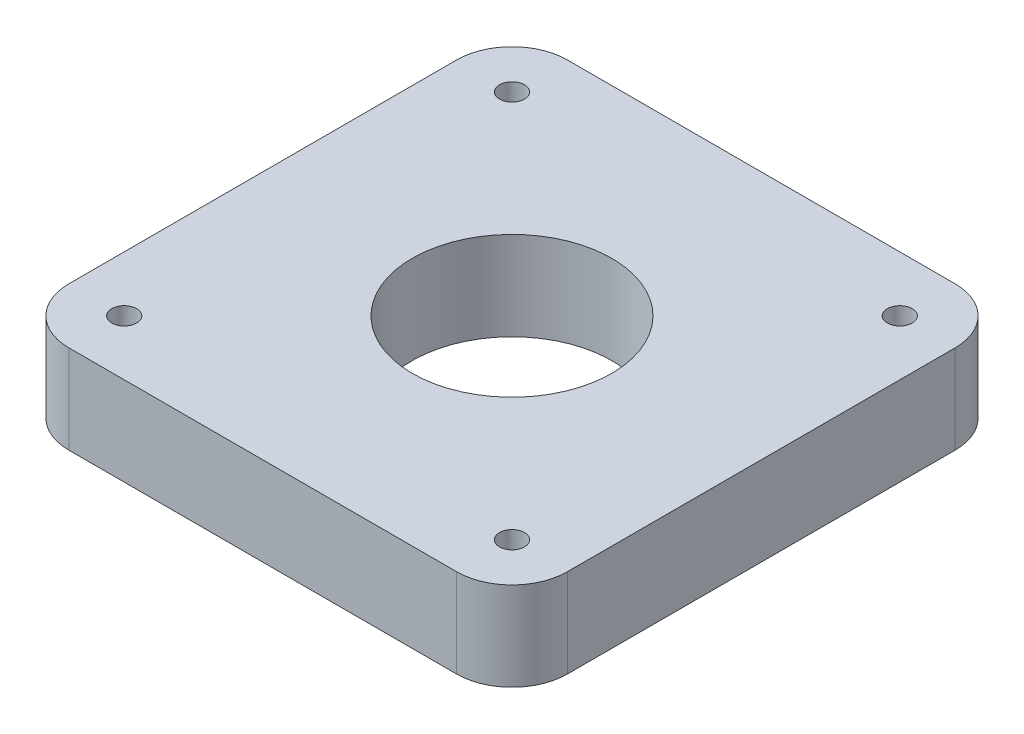
ISO-10303-21;
HEADER;
FILE_DESCRIPTION(('STEP AP214'),'2;1');
FILE_NAME('part.step','',(''),(''),'','','');
FILE_SCHEMA(('AUTOMOTIVE_DESIGN { 1 0 10303 214 1 1 1 1 }'));
ENDSEC;
DATA;
#1=APPLICATION_CONTEXT('core data for automotive mechanical design processes');
#2=APPLICATION_PROTOCOL_DEFINITION('international standard','automotive_design',2000,#1);
#3=PRODUCT_CONTEXT('',#1,'mechanical');
#4=PRODUCT('Part','Part','',(#3));
#5=PRODUCT_RELATED_PRODUCT_CATEGORY('part','',(#4));
#6=PRODUCT_DEFINITION_FORMATION('','',#4);
#7=PRODUCT_DEFINITION_CONTEXT('part definition',#1,'design');
#8=PRODUCT_DEFINITION('design','',#6,#7);
#9=PRODUCT_DEFINITION_SHAPE('','',#8);
#10=(LENGTH_UNIT() NAMED_UNIT(*) SI_UNIT(.MILLI.,.METRE.));
#11=(NAMED_UNIT(*) PLANE_ANGLE_UNIT() SI_UNIT($,.RADIAN.));
#12=(NAMED_UNIT(*) SI_UNIT($,.STERADIAN.) SOLID_ANGLE_UNIT());
#13=UNCERTAINTY_MEASURE_WITH_UNIT(LENGTH_MEASURE(1.E-05),#10,'distance_accuracy_value','');
#14=(GEOMETRIC_REPRESENTATION_CONTEXT(3) GLOBAL_UNCERTAINTY_ASSIGNED_CONTEXT((#13)) GLOBAL_UNIT_ASSIGNED_CONTEXT((#10,
#11,#12)) REPRESENTATION_CONTEXT('',''));
#15=CARTESIAN_POINT('',(0.,0.,0.));
#16=DIRECTION('',(0.,0.,1.));
#17=DIRECTION('',(1.,0.,0.));
#18=AXIS2_PLACEMENT_3D('',#15,#16,#17);
#19=CARTESIAN_POINT('',(0.,8.,22.5));
#20=DIRECTION('',(0.,0.,-1.));
#21=DIRECTION('',(-1.,0.,0.));
#22=AXIS2_PLACEMENT_3D('',#19,#20,#21);
#23=PLANE('',#22);
#24=DIRECTION('',(1.,0.,0.));
#25=VECTOR('',#24,1.);
#26=CARTESIAN_POINT('',(0.,0.,22.5));
#27=LINE('',#26,#25);
#28=CARTESIAN_POINT('',(-17.5,0.,22.5));
#29=VERTEX_POINT('',#28);
#30=CARTESIAN_POINT('',(17.5,0.,22.5));
#31=VERTEX_POINT('',#30);
#32=EDGE_CURVE('E113',#29,#31,#27,.T.);
#33=ORIENTED_EDGE('',*,*,#32,.T.);
#34=DIRECTION('',(0.,-1.,0.));
#35=VECTOR('',#34,1.);
#36=CARTESIAN_POINT('',(17.5,8.,22.5));
#37=LINE('',#36,#35);
#38=CARTESIAN_POINT('',(17.5,8.,22.5));
#39=VERTEX_POINT('',#38);
#40=EDGE_CURVE('E11',#31,#39,#37,.F.);
#41=ORIENTED_EDGE('',*,*,#40,.T.);
#42=DIRECTION('',(1.,0.,0.));
#43=VECTOR('',#42,1.);
#44=CARTESIAN_POINT('',(0.,8.,22.5));
#45=LINE('',#44,#43);
#46=CARTESIAN_POINT('',(-17.5,8.,22.5));
#47=VERTEX_POINT('',#46);
#48=EDGE_CURVE('E179',#47,#39,#45,.T.);
#49=ORIENTED_EDGE('',*,*,#48,.F.);
#50=DIRECTION('',(0.,-1.,0.));
#51=VECTOR('',#50,1.);
#52=CARTESIAN_POINT('',(-17.5,0.,22.5));
#53=LINE('',#52,#51);
#54=EDGE_CURVE('E50',#47,#29,#53,.T.);
#55=ORIENTED_EDGE('',*,*,#54,.T.);
#56=EDGE_LOOP('',(#33,#41,#49,#55));
#57=FACE_BOUND('',#56,.T.);
#58=ADVANCED_FACE('F41',(#57),#23,.F.);
#59=CARTESIAN_POINT('',(22.5,8.,0.));
#60=DIRECTION('',(-1.,0.,0.));
#61=DIRECTION('',(0.,0.,1.));
#62=AXIS2_PLACEMENT_3D('',#59,#60,#61);
#63=PLANE('',#62);
#64=DIRECTION('',(0.,0.,-1.));
#65=VECTOR('',#64,1.);
#66=CARTESIAN_POINT('',(22.5,0.,0.));
#67=LINE('',#66,#65);
#68=CARTESIAN_POINT('',(22.5,0.,17.5));
#69=VERTEX_POINT('',#68);
#70=CARTESIAN_POINT('',(22.5,0.,-17.5));
#71=VERTEX_POINT('',#70);
#72=EDGE_CURVE('E217',#69,#71,#67,.T.);
#73=ORIENTED_EDGE('',*,*,#72,.T.);
#74=DIRECTION('',(0.,-1.,0.));
#75=VECTOR('',#74,1.);
#76=CARTESIAN_POINT('',(22.5,8.,-17.5));
#77=LINE('',#76,#75);
#78=CARTESIAN_POINT('',(22.5,8.,-17.5));
#79=VERTEX_POINT('',#78);
#80=EDGE_CURVE('E57',#71,#79,#77,.F.);
#81=ORIENTED_EDGE('',*,*,#80,.T.);
#82=DIRECTION('',(0.,0.,-1.));
#83=VECTOR('',#82,1.);
#84=CARTESIAN_POINT('',(22.5,8.,0.));
#85=LINE('',#84,#83);
#86=CARTESIAN_POINT('',(22.5,8.,17.5));
#87=VERTEX_POINT('',#86);
#88=EDGE_CURVE('E181',#87,#79,#85,.T.);
#89=ORIENTED_EDGE('',*,*,#88,.F.);
#90=DIRECTION('',(0.,-1.,0.));
#91=VECTOR('',#90,1.);
#92=CARTESIAN_POINT('',(22.5,8.,17.5));
#93=LINE('',#92,#91);
#94=EDGE_CURVE('E170',#87,#69,#93,.T.);
#95=ORIENTED_EDGE('',*,*,#94,.T.);
#96=EDGE_LOOP('',(#73,#81,#89,#95));
#97=FACE_BOUND('',#96,.T.);
#98=ADVANCED_FACE('F245',(#97),#63,.F.);
#99=CARTESIAN_POINT('',(0.,8.,-22.5));
#100=DIRECTION('',(0.,0.,-1.));
#101=DIRECTION('',(-1.,0.,0.));
#102=AXIS2_PLACEMENT_3D('',#99,#100,#101);
#103=PLANE('',#102);
#104=DIRECTION('',(1.,0.,0.));
#105=VECTOR('',#104,1.);
#106=CARTESIAN_POINT('',(0.,0.,-22.5));
#107=LINE('',#106,#105);
#108=CARTESIAN_POINT('',(-17.5,0.,-22.5));
#109=VERTEX_POINT('',#108);
#110=CARTESIAN_POINT('',(17.5,0.,-22.5));
#111=VERTEX_POINT('',#110);
#112=EDGE_CURVE('E131',#109,#111,#107,.T.);
#113=ORIENTED_EDGE('',*,*,#112,.F.);
#114=DIRECTION('',(0.,-1.,0.));
#115=VECTOR('',#114,1.);
#116=CARTESIAN_POINT('',(-17.5,8.,-22.5));
#117=LINE('',#116,#115);
#118=CARTESIAN_POINT('',(-17.5,8.,-22.5));
#119=VERTEX_POINT('',#118);
#120=EDGE_CURVE('E157',#109,#119,#117,.F.);
#121=ORIENTED_EDGE('',*,*,#120,.T.);
#122=DIRECTION('',(1.,0.,0.));
#123=VECTOR('',#122,1.);
#124=CARTESIAN_POINT('',(0.,8.,-22.5));
#125=LINE('',#124,#123);
#126=CARTESIAN_POINT('',(17.5,8.,-22.5));
#127=VERTEX_POINT('',#126);
#128=EDGE_CURVE('E141',#119,#127,#125,.T.);
#129=ORIENTED_EDGE('',*,*,#128,.T.);
#130=DIRECTION('',(0.,-1.,0.));
#131=VECTOR('',#130,1.);
#132=CARTESIAN_POINT('',(17.5,0.,-22.5));
#133=LINE('',#132,#131);
#134=EDGE_CURVE('E153',#127,#111,#133,.T.);
#135=ORIENTED_EDGE('',*,*,#134,.T.);
#136=EDGE_LOOP('',(#113,#121,#129,#135));
#137=FACE_BOUND('',#136,.T.);
#138=ADVANCED_FACE('F225',(#137),#103,.T.);
#139=CARTESIAN_POINT('',(0.,8.,0.));
#140=DIRECTION('',(0.,-1.,0.));
#141=DIRECTION('',(0.,0.,-1.));
#142=AXIS2_PLACEMENT_3D('',#139,#140,#141);
#143=CYLINDRICAL_SURFACE('',#142,9.);
#144=CARTESIAN_POINT('',(0.,8.,0.));
#145=DIRECTION('',(0.,1.,0.));
#146=DIRECTION('',(0.,0.,1.));
#147=AXIS2_PLACEMENT_3D('',#144,#145,#146);
#148=CIRCLE('',#147,9.);
#149=CARTESIAN_POINT('',(0.,8.,8.99999999999999));
#150=VERTEX_POINT('',#149);
#151=EDGE_CURVE('E182',#150,#150,#148,.T.);
#152=ORIENTED_EDGE('',*,*,#151,.T.);
#153=EDGE_LOOP('',(#152));
#154=FACE_BOUND('',#153,.T.);
#155=CARTESIAN_POINT('',(0.,0.,0.));
#156=DIRECTION('',(0.,1.,0.));
#157=DIRECTION('',(0.,0.,1.));
#158=AXIS2_PLACEMENT_3D('',#155,#156,#157);
#159=CIRCLE('',#158,9.);
#160=CARTESIAN_POINT('',(0.,0.,8.99999999999999));
#161=VERTEX_POINT('',#160);
#162=EDGE_CURVE('E211',#161,#161,#159,.T.);
#163=ORIENTED_EDGE('',*,*,#162,.F.);
#164=EDGE_LOOP('',(#163));
#165=FACE_BOUND('',#164,.T.);
#166=ADVANCED_FACE('F253',(#154,#165),#143,.F.);
#167=CARTESIAN_POINT('',(-17.5,8.,-17.5));
#168=DIRECTION('',(0.,-1.,0.));
#169=DIRECTION('',(0.,0.,-1.));
#170=AXIS2_PLACEMENT_3D('',#167,#168,#169);
#171=CYLINDRICAL_SURFACE('',#170,1.125);
#172=CARTESIAN_POINT('',(-17.5,8.,-17.5));
#173=DIRECTION('',(0.,1.,0.));
#174=DIRECTION('',(0.,0.,1.));
#175=AXIS2_PLACEMENT_3D('',#172,#173,#174);
#176=CIRCLE('',#175,1.125);
#177=CARTESIAN_POINT('',(-17.5,8.,-16.375));
#178=VERTEX_POINT('',#177);
#179=EDGE_CURVE('E188',#178,#178,#176,.T.);
#180=ORIENTED_EDGE('',*,*,#179,.T.);
#181=EDGE_LOOP('',(#180));
#182=FACE_BOUND('',#181,.T.);
#183=CARTESIAN_POINT('',(-17.5,0.,-17.5));
#184=DIRECTION('',(0.,1.,0.));
#185=DIRECTION('',(0.,0.,1.));
#186=AXIS2_PLACEMENT_3D('',#183,#184,#185);
#187=CIRCLE('',#186,1.125);
#188=CARTESIAN_POINT('',(-17.5,0.,-16.375));
#189=VERTEX_POINT('',#188);
#190=EDGE_CURVE('E207',#189,#189,#187,.T.);
#191=ORIENTED_EDGE('',*,*,#190,.F.);
#192=EDGE_LOOP('',(#191));
#193=FACE_BOUND('',#192,.T.);
#194=ADVANCED_FACE('F256',(#182,#193),#171,.F.);
#195=CARTESIAN_POINT('',(17.5,8.,-17.5));
#196=DIRECTION('',(0.,-1.,0.));
#197=DIRECTION('',(0.,0.,-1.));
#198=AXIS2_PLACEMENT_3D('',#195,#196,#197);
#199=CYLINDRICAL_SURFACE('',#198,1.125);
#200=CARTESIAN_POINT('',(17.5,8.,-17.5));
#201=DIRECTION('',(0.,1.,0.));
#202=DIRECTION('',(0.,0.,1.));
#203=AXIS2_PLACEMENT_3D('',#200,#201,#202);
#204=CIRCLE('',#203,1.125);
#205=CARTESIAN_POINT('',(17.5,8.,-16.375));
#206=VERTEX_POINT('',#205);
#207=EDGE_CURVE('E398',#206,#206,#204,.T.);
#208=ORIENTED_EDGE('',*,*,#207,.T.);
#209=EDGE_LOOP('',(#208));
#210=FACE_BOUND('',#209,.T.);
#211=CARTESIAN_POINT('',(17.5,0.,-17.5));
#212=DIRECTION('',(0.,1.,0.));
#213=DIRECTION('',(0.,0.,1.));
#214=AXIS2_PLACEMENT_3D('',#211,#212,#213);
#215=CIRCLE('',#214,1.125);
#216=CARTESIAN_POINT('',(17.5,0.,-16.375));
#217=VERTEX_POINT('',#216);
#218=EDGE_CURVE('E203',#217,#217,#215,.T.);
#219=ORIENTED_EDGE('',*,*,#218,.F.);
#220=EDGE_LOOP('',(#219));
#221=FACE_BOUND('',#220,.T.);
#222=ADVANCED_FACE('F260',(#210,#221),#199,.F.);
#223=CARTESIAN_POINT('',(-17.5,8.,17.5));
#224=DIRECTION('',(0.,-1.,0.));
#225=DIRECTION('',(0.,0.,-1.));
#226=AXIS2_PLACEMENT_3D('',#223,#224,#225);
#227=CYLINDRICAL_SURFACE('',#226,1.125);
#228=CARTESIAN_POINT('',(-17.5,8.,17.5));
#229=DIRECTION('',(0.,1.,0.));
#230=DIRECTION('',(0.,0.,1.));
#231=AXIS2_PLACEMENT_3D('',#228,#229,#230);
#232=CIRCLE('',#231,1.125);
#233=CARTESIAN_POINT('',(-17.5,8.,18.625));
#234=VERTEX_POINT('',#233);
#235=EDGE_CURVE('E394',#234,#234,#232,.T.);
#236=ORIENTED_EDGE('',*,*,#235,.T.);
#237=EDGE_LOOP('',(#236));
#238=FACE_BOUND('',#237,.T.);
#239=CARTESIAN_POINT('',(-17.5,0.,17.5));
#240=DIRECTION('',(0.,1.,0.));
#241=DIRECTION('',(0.,0.,1.));
#242=AXIS2_PLACEMENT_3D('',#239,#240,#241);
#243=CIRCLE('',#242,1.125);
#244=CARTESIAN_POINT('',(-17.5,0.,18.625));
#245=VERTEX_POINT('',#244);
#246=EDGE_CURVE('E199',#245,#245,#243,.T.);
#247=ORIENTED_EDGE('',*,*,#246,.F.);
#248=EDGE_LOOP('',(#247));
#249=FACE_BOUND('',#248,.T.);
#250=ADVANCED_FACE('F264',(#238,#249),#227,.F.);
#251=CARTESIAN_POINT('',(17.5,8.,17.5));
#252=DIRECTION('',(0.,-1.,0.));
#253=DIRECTION('',(0.,0.,-1.));
#254=AXIS2_PLACEMENT_3D('',#251,#252,#253);
#255=CYLINDRICAL_SURFACE('',#254,1.125);
#256=CARTESIAN_POINT('',(17.5,8.,17.5));
#257=DIRECTION('',(0.,1.,0.));
#258=DIRECTION('',(0.,0.,1.));
#259=AXIS2_PLACEMENT_3D('',#256,#257,#258);
#260=CIRCLE('',#259,1.125);
#261=CARTESIAN_POINT('',(17.5,8.,18.625));
#262=VERTEX_POINT('',#261);
#263=EDGE_CURVE('E130',#262,#262,#260,.T.);
#264=ORIENTED_EDGE('',*,*,#263,.T.);
#265=EDGE_LOOP('',(#264));
#266=FACE_BOUND('',#265,.T.);
#267=CARTESIAN_POINT('',(17.5,0.,17.5));
#268=DIRECTION('',(0.,1.,0.));
#269=DIRECTION('',(0.,0.,1.));
#270=AXIS2_PLACEMENT_3D('',#267,#268,#269);
#271=CIRCLE('',#270,1.125);
#272=CARTESIAN_POINT('',(17.5,0.,18.625));
#273=VERTEX_POINT('',#272);
#274=EDGE_CURVE('E195',#273,#273,#271,.T.);
#275=ORIENTED_EDGE('',*,*,#274,.F.);
#276=EDGE_LOOP('',(#275));
#277=FACE_BOUND('',#276,.T.);
#278=ADVANCED_FACE('F268',(#266,#277),#255,.F.);
#279=CARTESIAN_POINT('',(-22.5,8.,0.));
#280=DIRECTION('',(-1.,0.,0.));
#281=DIRECTION('',(0.,0.,1.));
#282=AXIS2_PLACEMENT_3D('',#279,#280,#281);
#283=PLANE('',#282);
#284=DIRECTION('',(0.,0.,-1.));
#285=VECTOR('',#284,1.);
#286=CARTESIAN_POINT('',(-22.5,8.,0.));
#287=LINE('',#286,#285);
#288=CARTESIAN_POINT('',(-22.5,8.,17.5));
#289=VERTEX_POINT('',#288);
#290=CARTESIAN_POINT('',(-22.5,8.,-17.5));
#291=VERTEX_POINT('',#290);
#292=EDGE_CURVE('E136',#289,#291,#287,.T.);
#293=ORIENTED_EDGE('',*,*,#292,.T.);
#294=DIRECTION('',(0.,-1.,0.));
#295=VECTOR('',#294,1.);
#296=CARTESIAN_POINT('',(-22.5,8.,-17.5));
#297=LINE('',#296,#295);
#298=CARTESIAN_POINT('',(-22.5,0.,-17.5));
#299=VERTEX_POINT('',#298);
#300=EDGE_CURVE('E120',#291,#299,#297,.T.);
#301=ORIENTED_EDGE('',*,*,#300,.T.);
#302=DIRECTION('',(0.,0.,-1.));
#303=VECTOR('',#302,1.);
#304=CARTESIAN_POINT('',(-22.5,0.,0.));
#305=LINE('',#304,#303);
#306=CARTESIAN_POINT('',(-22.5,0.,17.5));
#307=VERTEX_POINT('',#306);
#308=EDGE_CURVE('E111',#307,#299,#305,.T.);
#309=ORIENTED_EDGE('',*,*,#308,.F.);
#310=DIRECTION('',(0.,-1.,0.));
#311=VECTOR('',#310,1.);
#312=CARTESIAN_POINT('',(-22.5,8.,17.5));
#313=LINE('',#312,#311);
#314=EDGE_CURVE('E126',#307,#289,#313,.F.);
#315=ORIENTED_EDGE('',*,*,#314,.T.);
#316=EDGE_LOOP('',(#293,#301,#309,#315));
#317=FACE_BOUND('',#316,.T.);
#318=ADVANCED_FACE('F125',(#317),#283,.T.);
#319=CARTESIAN_POINT('',(0.,8.,0.));
#320=DIRECTION('',(0.,1.,0.));
#321=DIRECTION('',(0.,0.,1.));
#322=AXIS2_PLACEMENT_3D('',#319,#320,#321);
#323=PLANE('',#322);
#324=ORIENTED_EDGE('',*,*,#263,.F.);
#325=EDGE_LOOP('',(#324));
#326=FACE_BOUND('',#325,.T.);
#327=ORIENTED_EDGE('',*,*,#235,.F.);
#328=EDGE_LOOP('',(#327));
#329=FACE_BOUND('',#328,.T.);
#330=ORIENTED_EDGE('',*,*,#207,.F.);
#331=EDGE_LOOP('',(#330));
#332=FACE_BOUND('',#331,.T.);
#333=ORIENTED_EDGE('',*,*,#179,.F.);
#334=EDGE_LOOP('',(#333));
#335=FACE_BOUND('',#334,.T.);
#336=ORIENTED_EDGE('',*,*,#151,.F.);
#337=EDGE_LOOP('',(#336));
#338=FACE_BOUND('',#337,.T.);
#339=ORIENTED_EDGE('',*,*,#128,.F.);
#340=CARTESIAN_POINT('',(-17.5,8.,-17.5));
#341=DIRECTION('',(0.,1.,0.));
#342=DIRECTION('',(0.,0.,1.));
#343=AXIS2_PLACEMENT_3D('',#340,#341,#342);
#344=CIRCLE('',#343,5.);
#345=EDGE_CURVE('E167',#119,#291,#344,.T.);
#346=ORIENTED_EDGE('',*,*,#345,.T.);
#347=ORIENTED_EDGE('',*,*,#292,.F.);
#348=CARTESIAN_POINT('',(-17.5,8.,17.5));
#349=DIRECTION('',(0.,1.,0.));
#350=DIRECTION('',(0.,0.,1.));
#351=AXIS2_PLACEMENT_3D('',#348,#349,#350);
#352=CIRCLE('',#351,5.);
#353=EDGE_CURVE('E134',#289,#47,#352,.T.);
#354=ORIENTED_EDGE('',*,*,#353,.T.);
#355=ORIENTED_EDGE('',*,*,#48,.T.);
#356=CARTESIAN_POINT('',(17.5,8.,17.5));
#357=DIRECTION('',(0.,1.,0.));
#358=DIRECTION('',(0.,0.,1.));
#359=AXIS2_PLACEMENT_3D('',#356,#357,#358);
#360=CIRCLE('',#359,5.);
#361=EDGE_CURVE('E64',#39,#87,#360,.T.);
#362=ORIENTED_EDGE('',*,*,#361,.T.);
#363=ORIENTED_EDGE('',*,*,#88,.T.);
#364=CARTESIAN_POINT('',(17.5,8.,-17.5));
#365=DIRECTION('',(0.,1.,0.));
#366=DIRECTION('',(0.,0.,1.));
#367=AXIS2_PLACEMENT_3D('',#364,#365,#366);
#368=CIRCLE('',#367,5.);
#369=EDGE_CURVE('E164',#79,#127,#368,.T.);
#370=ORIENTED_EDGE('',*,*,#369,.T.);
#371=EDGE_LOOP('',(#339,#346,#347,#354,#355,#362,#363,#370));
#372=FACE_BOUND('',#371,.T.);
#373=ADVANCED_FACE('F231',(#326,#329,#332,#335,#338,#372),#323,.T.);
#374=CARTESIAN_POINT('',(0.,0.,0.));
#375=DIRECTION('',(0.,1.,0.));
#376=DIRECTION('',(0.,0.,1.));
#377=AXIS2_PLACEMENT_3D('',#374,#375,#376);
#378=PLANE('',#377);
#379=ORIENTED_EDGE('',*,*,#274,.T.);
#380=EDGE_LOOP('',(#379));
#381=FACE_BOUND('',#380,.T.);
#382=ORIENTED_EDGE('',*,*,#246,.T.);
#383=EDGE_LOOP('',(#382));
#384=FACE_BOUND('',#383,.T.);
#385=ORIENTED_EDGE('',*,*,#218,.T.);
#386=EDGE_LOOP('',(#385));
#387=FACE_BOUND('',#386,.T.);
#388=ORIENTED_EDGE('',*,*,#190,.T.);
#389=EDGE_LOOP('',(#388));
#390=FACE_BOUND('',#389,.T.);
#391=ORIENTED_EDGE('',*,*,#162,.T.);
#392=EDGE_LOOP('',(#391));
#393=FACE_BOUND('',#392,.T.);
#394=ORIENTED_EDGE('',*,*,#308,.T.);
#395=CARTESIAN_POINT('',(-17.5,0.,-17.5));
#396=DIRECTION('',(0.,1.,0.));
#397=DIRECTION('',(0.,0.,1.));
#398=AXIS2_PLACEMENT_3D('',#395,#396,#397);
#399=CIRCLE('',#398,5.);
#400=EDGE_CURVE('E150',#299,#109,#399,.F.);
#401=ORIENTED_EDGE('',*,*,#400,.T.);
#402=ORIENTED_EDGE('',*,*,#112,.T.);
#403=CARTESIAN_POINT('',(17.5,0.,-17.5));
#404=DIRECTION('',(0.,1.,0.));
#405=DIRECTION('',(0.,0.,1.));
#406=AXIS2_PLACEMENT_3D('',#403,#404,#405);
#407=CIRCLE('',#406,5.);
#408=EDGE_CURVE('E147',#111,#71,#407,.F.);
#409=ORIENTED_EDGE('',*,*,#408,.T.);
#410=ORIENTED_EDGE('',*,*,#72,.F.);
#411=CARTESIAN_POINT('',(17.5,0.,17.5));
#412=DIRECTION('',(0.,1.,0.));
#413=DIRECTION('',(0.,0.,1.));
#414=AXIS2_PLACEMENT_3D('',#411,#412,#413);
#415=CIRCLE('',#414,5.);
#416=EDGE_CURVE('E119',#69,#31,#415,.F.);
#417=ORIENTED_EDGE('',*,*,#416,.T.);
#418=ORIENTED_EDGE('',*,*,#32,.F.);
#419=CARTESIAN_POINT('',(-17.5,0.,17.5));
#420=DIRECTION('',(0.,1.,0.));
#421=DIRECTION('',(0.,0.,1.));
#422=AXIS2_PLACEMENT_3D('',#419,#420,#421);
#423=CIRCLE('',#422,5.);
#424=EDGE_CURVE('E108',#29,#307,#423,.F.);
#425=ORIENTED_EDGE('',*,*,#424,.T.);
#426=EDGE_LOOP('',(#394,#401,#402,#409,#410,#417,#418,#425));
#427=FACE_BOUND('',#426,.T.);
#428=ADVANCED_FACE('F110',(#381,#384,#387,#390,#393,#427),#378,.F.);
#429=CARTESIAN_POINT('',(-17.5,8.,-17.5));
#430=DIRECTION('',(0.,-1.,0.));
#431=DIRECTION('',(0.,0.,-1.));
#432=AXIS2_PLACEMENT_3D('',#429,#430,#431);
#433=CYLINDRICAL_SURFACE('',#432,5.);
#434=ORIENTED_EDGE('',*,*,#345,.F.);
#435=ORIENTED_EDGE('',*,*,#120,.F.);
#436=ORIENTED_EDGE('',*,*,#400,.F.);
#437=ORIENTED_EDGE('',*,*,#300,.F.);
#438=EDGE_LOOP('',(#434,#435,#436,#437));
#439=FACE_BOUND('',#438,.T.);
#440=ADVANCED_FACE('F230',(#439),#433,.T.);
#441=CARTESIAN_POINT('',(17.5,8.,-17.5));
#442=DIRECTION('',(0.,1.,0.));
#443=DIRECTION('',(0.,0.,1.));
#444=AXIS2_PLACEMENT_3D('',#441,#442,#443);
#445=CYLINDRICAL_SURFACE('',#444,5.);
#446=ORIENTED_EDGE('',*,*,#369,.F.);
#447=ORIENTED_EDGE('',*,*,#80,.F.);
#448=ORIENTED_EDGE('',*,*,#408,.F.);
#449=ORIENTED_EDGE('',*,*,#134,.F.);
#450=EDGE_LOOP('',(#446,#447,#448,#449));
#451=FACE_BOUND('',#450,.T.);
#452=ADVANCED_FACE('F234',(#451),#445,.T.);
#453=CARTESIAN_POINT('',(17.5,8.,17.5));
#454=DIRECTION('',(0.,-1.,0.));
#455=DIRECTION('',(0.,0.,-1.));
#456=AXIS2_PLACEMENT_3D('',#453,#454,#455);
#457=CYLINDRICAL_SURFACE('',#456,5.);
#458=ORIENTED_EDGE('',*,*,#361,.F.);
#459=ORIENTED_EDGE('',*,*,#40,.F.);
#460=ORIENTED_EDGE('',*,*,#416,.F.);
#461=ORIENTED_EDGE('',*,*,#94,.F.);
#462=EDGE_LOOP('',(#458,#459,#460,#461));
#463=FACE_BOUND('',#462,.T.);
#464=ADVANCED_FACE('F236',(#463),#457,.T.);
#465=CARTESIAN_POINT('',(-17.5,8.,17.5));
#466=DIRECTION('',(0.,1.,0.));
#467=DIRECTION('',(0.,0.,1.));
#468=AXIS2_PLACEMENT_3D('',#465,#466,#467);
#469=CYLINDRICAL_SURFACE('',#468,5.);
#470=ORIENTED_EDGE('',*,*,#353,.F.);
#471=ORIENTED_EDGE('',*,*,#314,.F.);
#472=ORIENTED_EDGE('',*,*,#424,.F.);
#473=ORIENTED_EDGE('',*,*,#54,.F.);
#474=EDGE_LOOP('',(#470,#471,#472,#473));
#475=FACE_BOUND('',#474,.T.);
#476=ADVANCED_FACE('F43',(#475),#469,.T.);
#477=CLOSED_SHELL('',(#58,#98,#138,#166,#194,#222,#250,#278,#318,#373,#428,#440,#452,#464,#476));
#478=MANIFOLD_SOLID_BREP('B2',#477);
#479=ADVANCED_BREP_SHAPE_REPRESENTATION('',(#18,#478),#14);
#480=SHAPE_DEFINITION_REPRESENTATION(#9,#479);
ENDSEC;
END-ISO-10303-21;
